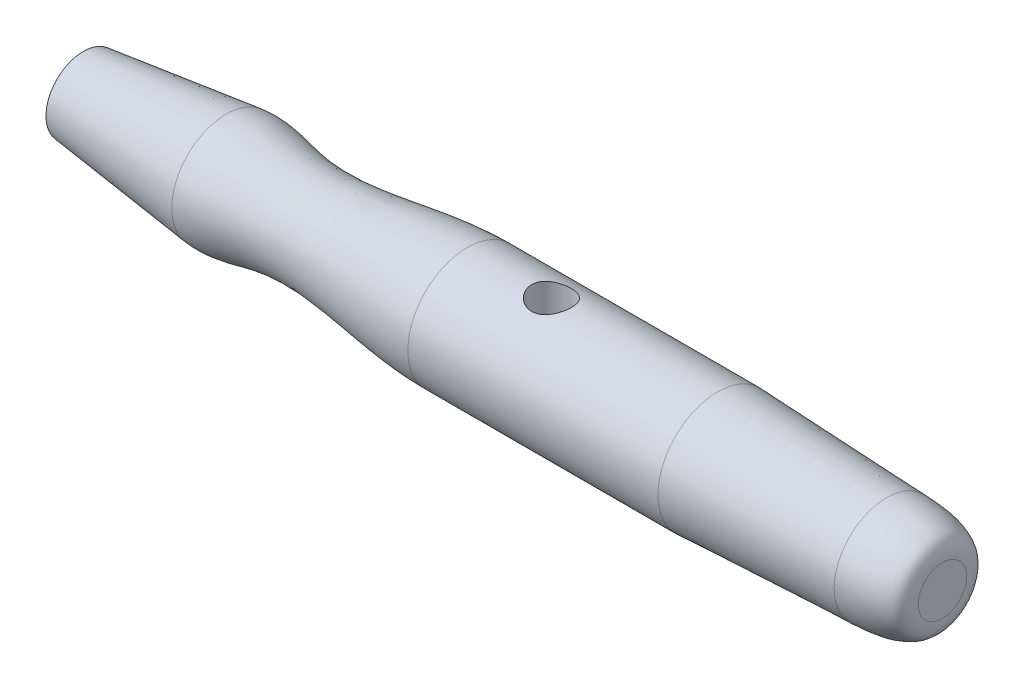
ISO-10303-21;
HEADER;
FILE_DESCRIPTION(('STEP AP214'),'2;1');
FILE_NAME('part.step','',(''),(''),'','','');
FILE_SCHEMA(('AUTOMOTIVE_DESIGN { 1 0 10303 214 1 1 1 1 }'));
ENDSEC;
DATA;
#1=APPLICATION_CONTEXT('core data for automotive mechanical design processes');
#2=APPLICATION_PROTOCOL_DEFINITION('international standard','automotive_design',2000,#1);
#3=PRODUCT_CONTEXT('',#1,'mechanical');
#4=PRODUCT('Part','Part','',(#3));
#5=PRODUCT_RELATED_PRODUCT_CATEGORY('part','',(#4));
#6=PRODUCT_DEFINITION_FORMATION('','',#4);
#7=PRODUCT_DEFINITION_CONTEXT('part definition',#1,'design');
#8=PRODUCT_DEFINITION('design','',#6,#7);
#9=PRODUCT_DEFINITION_SHAPE('','',#8);
#10=(LENGTH_UNIT() NAMED_UNIT(*) SI_UNIT(.MILLI.,.METRE.));
#11=(NAMED_UNIT(*) PLANE_ANGLE_UNIT() SI_UNIT($,.RADIAN.));
#12=(NAMED_UNIT(*) SI_UNIT($,.STERADIAN.) SOLID_ANGLE_UNIT());
#13=UNCERTAINTY_MEASURE_WITH_UNIT(LENGTH_MEASURE(1.E-05),#10,'distance_accuracy_value','');
#14=(GEOMETRIC_REPRESENTATION_CONTEXT(3) GLOBAL_UNCERTAINTY_ASSIGNED_CONTEXT((#13)) GLOBAL_UNIT_ASSIGNED_CONTEXT((#10,
#11,#12)) REPRESENTATION_CONTEXT('',''));
#15=CARTESIAN_POINT('',(0.,0.,0.));
#16=DIRECTION('',(0.,0.,1.));
#17=DIRECTION('',(1.,0.,0.));
#18=AXIS2_PLACEMENT_3D('',#15,#16,#17);
#19=CARTESIAN_POINT('',(-137.5,0.,0.));
#20=DIRECTION('',(-1.,0.,0.));
#21=DIRECTION('',(0.,-1.,0.));
#22=AXIS2_PLACEMENT_3D('',#19,#20,#21);
#23=CYLINDRICAL_SURFACE('',#22,19.05);
#24=CARTESIAN_POINT('',(-14.564,0.,0.));
#25=DIRECTION('',(-1.,0.,0.));
#26=DIRECTION('',(0.,-1.,0.));
#27=AXIS2_PLACEMENT_3D('',#24,#25,#26);
#28=CIRCLE('',#27,19.05);
#29=CARTESIAN_POINT('',(-14.564,-19.0499999999999,0.));
#30=VERTEX_POINT('',#29);
#31=EDGE_CURVE('E66',#30,#30,#28,.T.);
#32=ORIENTED_EDGE('',*,*,#31,.F.);
#33=EDGE_LOOP('',(#32));
#34=FACE_BOUND('',#33,.T.);
#35=CARTESIAN_POINT('',(65.5,0.,0.));
#36=DIRECTION('',(-1.,0.,0.));
#37=DIRECTION('',(0.,-1.,0.));
#38=AXIS2_PLACEMENT_3D('',#35,#36,#37);
#39=CIRCLE('',#38,19.05);
#40=CARTESIAN_POINT('',(65.5,-19.0499999999999,0.));
#41=VERTEX_POINT('',#40);
#42=EDGE_CURVE('E60',#41,#41,#39,.T.);
#43=ORIENTED_EDGE('',*,*,#42,.T.);
#44=EDGE_LOOP('',(#43));
#45=FACE_BOUND('',#44,.T.);
#46=CARTESIAN_POINT('',(12.36,17.9605122421383,-6.35));
#47=CARTESIAN_POINT('',(12.5329048893612,17.9605121841743,-6.35000007467187));
#48=CARTESIAN_POINT('',(12.7058086993195,17.9630158170993,-6.34293207443151));
#49=CARTESIAN_POINT('',(13.0503843538287,17.9729507908354,-6.31472584323583));
#50=CARTESIAN_POINT('',(13.2220557255694,17.9803839303172,-6.29358247647192));
#51=CARTESIAN_POINT('',(13.5627977784464,17.9999387474085,-6.23743424237858));
#52=CARTESIAN_POINT('',(13.7318690890143,18.0120592710937,-6.20243278653587));
#53=CARTESIAN_POINT('',(14.0663229836838,18.0406142280405,-6.11887938259321));
#54=CARTESIAN_POINT('',(14.2317040989144,18.0570503470113,-6.07032213901403));
#55=CARTESIAN_POINT('',(14.5572047901502,18.0936898864177,-5.9602215150775));
#56=CARTESIAN_POINT('',(14.7173359800168,18.1138842233465,-5.89870940004715));
#57=CARTESIAN_POINT('',(15.0317916435437,18.1574836120493,-5.76310329571688));
#58=CARTESIAN_POINT('',(15.186113936605,18.1808898545199,-5.68900463798159));
#59=CARTESIAN_POINT('',(15.4879320456376,18.2302439315275,-5.52880871589195));
#60=CARTESIAN_POINT('',(15.6354291340736,18.2561912894746,-5.44271370019568));
#61=CARTESIAN_POINT('',(15.9228285658147,18.3099374140938,-5.25907267568229));
#62=CARTESIAN_POINT('',(16.0627281535657,18.3377368444647,-5.16152255221946));
#63=CARTESIAN_POINT('',(16.3388924543855,18.3954535011269,-4.9519704663745));
#64=CARTESIAN_POINT('',(16.4748537151547,18.4254108542597,-4.83957945535955));
#65=CARTESIAN_POINT('',(16.7369169809071,18.4857008813243,-4.60392786160509));
#66=CARTESIAN_POINT('',(16.86301879383,18.5160335625541,-4.48066706722364));
#67=CARTESIAN_POINT('',(17.1046289023187,18.5762700584007,-4.22398755491756));
#68=CARTESIAN_POINT('',(17.2201336501056,18.6061737265825,-4.09056546226525));
#69=CARTESIAN_POINT('',(17.4397204364232,18.6647358311806,-3.81445197871254));
#70=CARTESIAN_POINT('',(17.5438064424056,18.6933946980002,-3.67176383491661));
#71=CARTESIAN_POINT('',(17.742496600939,18.7494517961145,-3.3740336259551));
#72=CARTESIAN_POINT('',(17.8367755240712,18.776796334375,-3.21876410858282));
#73=CARTESIAN_POINT('',(18.0118252185834,18.828598949967,-2.90040622051583));
#74=CARTESIAN_POINT('',(18.0926013189444,18.853058164884,-2.73732096720631));
#75=CARTESIAN_POINT('',(18.2400258776401,18.8984068456182,-2.40436062510117));
#76=CARTESIAN_POINT('',(18.3066714481517,18.9192955815763,-2.23448415681591));
#77=CARTESIAN_POINT('',(18.4251801326333,18.9568787025541,-1.88927888325925));
#78=CARTESIAN_POINT('',(18.4770498876315,18.9735749714878,-1.71395256686032));
#79=CARTESIAN_POINT('',(18.5640178166869,19.0017947733666,-1.36522428846162));
#80=CARTESIAN_POINT('',(18.5996316094182,19.01347650807,-1.19196364650285));
#81=CARTESIAN_POINT('',(18.656290767647,19.0321454456513,-0.842895111101326));
#82=CARTESIAN_POINT('',(18.6773421163871,19.0391345765353,-0.667088294148715));
#83=CARTESIAN_POINT('',(18.7046899160807,19.0482262560928,-0.314209218879316));
#84=CARTESIAN_POINT('',(18.7109867609576,19.0503289352273,-0.137136994473646));
#85=CARTESIAN_POINT('',(18.7087627466738,19.049587568049,0.216901921002763));
#86=CARTESIAN_POINT('',(18.7002422305748,19.0467436362635,0.393868614421933));
#87=CARTESIAN_POINT('',(18.669098834915,19.036399993617,0.739365284519381));
#88=CARTESIAN_POINT('',(18.6470456785782,19.0290884203769,0.907952629393989));
#89=CARTESIAN_POINT('',(18.5895414290879,19.0101669985195,1.24263965626492));
#90=CARTESIAN_POINT('',(18.5540858063356,18.9985556967605,1.40873847746823));
#91=CARTESIAN_POINT('',(18.4701030565091,18.9713411108767,1.73720119624074));
#92=CARTESIAN_POINT('',(18.4215801834594,18.9557391259958,1.89956629068116));
#93=CARTESIAN_POINT('',(18.3118429721928,18.9209335884611,2.21961616319675));
#94=CARTESIAN_POINT('',(18.2506238452836,18.9017286771399,2.37729914957653));
#95=CARTESIAN_POINT('',(18.1151258842597,18.8599382105028,2.68891421853453));
#96=CARTESIAN_POINT('',(18.0406903922671,18.8373126491989,2.8427727771282));
#97=CARTESIAN_POINT('',(17.8798366047179,18.7894305663877,3.14372828729916));
#98=CARTESIAN_POINT('',(17.7934142086573,18.7641731453071,3.29082290202758));
#99=CARTESIAN_POINT('',(17.6092010479193,18.7116626522826,3.57734506918722));
#100=CARTESIAN_POINT('',(17.5114096459081,18.6844094684901,3.71677219114134));
#101=CARTESIAN_POINT('',(17.3050923455741,18.6285822698494,3.98716495399287));
#102=CARTESIAN_POINT('',(17.1965660566329,18.6000082069575,4.11813028669789));
#103=CARTESIAN_POINT('',(16.9640616572674,18.5408779551479,4.37684545048268));
#104=CARTESIAN_POINT('',(16.8395955104998,18.5102919359601,4.50415027127115));
#105=CARTESIAN_POINT('',(16.5804397296168,18.4492888676298,4.74784339620421));
#106=CARTESIAN_POINT('',(16.4457533108898,18.4188717685491,4.86423510815807));
#107=CARTESIAN_POINT('',(16.1668732938627,18.3590231511138,5.08546063018026));
#108=CARTESIAN_POINT('',(16.0226747287521,18.3295921599489,5.19028832447545));
#109=CARTESIAN_POINT('',(15.72577596231,18.2725815338622,5.38756027003843));
#110=CARTESIAN_POINT('',(15.5730791107501,18.2450011787983,5.480009352328));
#111=CARTESIAN_POINT('',(15.2577787513559,18.1921032459389,5.65315834756608));
#112=CARTESIAN_POINT('',(15.0950624597289,18.1668249772563,5.73366516353339));
#113=CARTESIAN_POINT('',(14.7629640367406,18.1198022602484,5.88057969904579));
#114=CARTESIAN_POINT('',(14.5935845355197,18.0980564346221,5.94699291679969));
#115=CARTESIAN_POINT('',(14.2493279189632,18.058801934227,6.06515064268838));
#116=CARTESIAN_POINT('',(14.0744515836549,18.0412926613106,6.1168972217438));
#117=CARTESIAN_POINT('',(13.7205023634224,18.0111045097315,6.20522346520949));
#118=CARTESIAN_POINT('',(13.5414296954307,17.9984253819528,6.24180391182512));
#119=CARTESIAN_POINT('',(13.1886577023196,17.9787949890032,6.29811699796801));
#120=CARTESIAN_POINT('',(13.015080565666,17.971611063163,6.31853543370886));
#121=CARTESIAN_POINT('',(12.6667009613968,17.9622869124369,6.34499394377563));
#122=CARTESIAN_POINT('',(12.4918985372033,17.9601465097146,6.35103452507011));
#123=CARTESIAN_POINT('',(12.1424325037919,17.9609801314463,6.34867652793738));
#124=CARTESIAN_POINT('',(11.9677688768581,17.9639533388488,6.34028025622768));
#125=CARTESIAN_POINT('',(11.6198868596507,17.9749142495206,6.309138563187));
#126=CARTESIAN_POINT('',(11.4466684516347,17.9829018911375,6.28639331827606));
#127=CARTESIAN_POINT('',(11.1089237860065,18.0032708197849,6.22781361622577));
#128=CARTESIAN_POINT('',(10.9443041443268,18.0154905329272,6.19245924965254));
#129=CARTESIAN_POINT('',(10.6186672221139,18.0439996158971,6.10888905897269));
#130=CARTESIAN_POINT('',(10.4576511538251,18.0602903334414,6.06066897527755));
#131=CARTESIAN_POINT('',(10.1403442530326,18.0964645265794,5.95178614996644));
#132=CARTESIAN_POINT('',(9.9840523706642,18.1163471969716,5.89112619656182));
#133=CARTESIAN_POINT('',(9.67704386351722,18.1591611703442,5.75780047904466));
#134=CARTESIAN_POINT('',(9.52632938354142,18.1820936308712,5.68513015384566));
#135=CARTESIAN_POINT('',(9.22677607737642,18.2311431035954,5.52585539435068));
#136=CARTESIAN_POINT('',(9.07814421393858,18.257337418412,5.4388855184361));
#137=CARTESIAN_POINT('',(8.78861963569909,18.3115953760894,5.25331510969612));
#138=CARTESIAN_POINT('',(8.64772961588815,18.3396596624723,5.15471056388415));
#139=CARTESIAN_POINT('',(8.37453406252708,18.3969044730028,4.9465198326357));
#140=CARTESIAN_POINT('',(8.24222930474783,18.4260850976459,4.83693265707056));
#141=CARTESIAN_POINT('',(7.98697045700054,18.4848033864811,4.60744722274103));
#142=CARTESIAN_POINT('',(7.86401658404977,18.5143410589412,4.48754872480687));
#143=CARTESIAN_POINT('',(7.62246831380917,18.5744412121883,4.23209963560971));
#144=CARTESIAN_POINT('',(7.50437239621551,18.6049841614765,4.09607248840989));
#145=CARTESIAN_POINT('',(7.28007578377248,18.664778246815,3.81435164909172));
#146=CARTESIAN_POINT('',(7.17387112411002,18.6940298114599,3.66866120488881));
#147=CARTESIAN_POINT('',(6.97402901818268,18.7504530318865,3.3684336930749));
#148=CARTESIAN_POINT('',(6.88039635203512,18.7776238948672,3.21389329221657));
#149=CARTESIAN_POINT('',(6.70650426640412,18.8291029215125,2.89708847566713));
#150=CARTESIAN_POINT('',(6.62623923996242,18.8534122841516,2.73482733528804));
#151=CARTESIAN_POINT('',(6.48015853214839,18.8983526620096,2.40465168177921));
#152=CARTESIAN_POINT('',(6.41425641078046,18.9190055333313,2.23677842238123));
#153=CARTESIAN_POINT('',(6.29688441019861,18.9562198624823,1.89569072154763));
#154=CARTESIAN_POINT('',(6.24540867351838,18.9727829805258,1.72247847967073));
#155=CARTESIAN_POINT('',(6.15734792817547,19.0013461729396,1.37195443604879));
#156=CARTESIAN_POINT('',(6.12076150306406,19.0133466813523,1.19464302596226));
#157=CARTESIAN_POINT('',(6.06284105210709,19.0324318084485,0.837286870863789));
#158=CARTESIAN_POINT('',(6.04150636962456,19.0395166387673,0.657242243866559));
#159=CARTESIAN_POINT('',(6.0149507937708,19.0483464738216,0.304399939069057));
#160=CARTESIAN_POINT('',(6.00901662773618,19.050327811339,0.131661476409807));
#161=CARTESIAN_POINT('',(6.01124883539023,19.049583701765,-0.21377539227599));
#162=CARTESIAN_POINT('',(6.01942001187633,19.0468566514914,-0.386473764626123));
#163=CARTESIAN_POINT('',(6.04978713971672,19.036769222305,-0.730414910159583));
#164=CARTESIAN_POINT('',(6.07197673003419,19.0294109448771,-0.90165830785822));
#165=CARTESIAN_POINT('',(6.1301769110018,19.010258841641,-1.24159215291774));
#166=CARTESIAN_POINT('',(6.16619266298495,18.9984633594488,-1.41028162241909));
#167=CARTESIAN_POINT('',(6.25101904977245,18.9709796061496,-1.74113205541997));
#168=CARTESIAN_POINT('',(6.29961147550841,18.9553579469971,-1.90335462060486));
#169=CARTESIAN_POINT('',(6.40946667760174,18.920521496432,-2.22311558916087));
#170=CARTESIAN_POINT('',(6.47073396730047,18.9013054253338,-2.38065230104733));
#171=CARTESIAN_POINT('',(6.60543358155544,18.8597702235758,-2.68996559538903));
#172=CARTESIAN_POINT('',(6.67886325404243,18.8374517695764,-2.84174342474925));
#173=CARTESIAN_POINT('',(6.8373888061244,18.7902503646299,-3.13872746855851));
#174=CARTESIAN_POINT('',(6.9224888671748,18.7653664953012,-3.28393130265417));
#175=CARTESIAN_POINT('',(7.10709571414095,18.7126933760356,-3.57209205622814));
#176=CARTESIAN_POINT('',(7.20701719248428,18.6848309370529,-3.71477001212558));
#177=CARTESIAN_POINT('',(7.41808742629958,18.6277261015556,-3.99127224330518));
#178=CARTESIAN_POINT('',(7.52923657499846,18.5984836567283,-4.12509620822201));
#179=CARTESIAN_POINT('',(7.76210974791763,18.5393610594388,-4.38316388676336));
#180=CARTESIAN_POINT('',(7.88383853090085,18.5094806246121,-4.50740324126623));
#181=CARTESIAN_POINT('',(8.13705111119739,18.4498824788936,-4.74546004441081));
#182=CARTESIAN_POINT('',(8.26853175258196,18.4201647186707,-4.85928083833075));
#183=CARTESIAN_POINT('',(8.5459046797865,18.3605083051536,-5.0801412712014));
#184=CARTESIAN_POINT('',(8.69216146794026,18.3306074981088,-5.18673395080548));
#185=CARTESIAN_POINT('',(8.9934458815642,18.2727076517125,-5.38716410257997));
#186=CARTESIAN_POINT('',(9.14847020652462,18.2447079053334,-5.4810063299439));
#187=CARTESIAN_POINT('',(9.4663733732635,18.191440834821,-5.65528861435427));
#188=CARTESIAN_POINT('',(9.62925378111994,18.1661740587765,-5.73572598484048));
#189=CARTESIAN_POINT('',(9.96167102085719,18.119186796233,-5.88247472021432));
#190=CARTESIAN_POINT('',(10.1312048076611,18.09746471037,-5.9487924600178));
#191=CARTESIAN_POINT('',(10.4680578405731,18.0591448851981,-6.06410020462713));
#192=CARTESIAN_POINT('',(10.635135783141,18.042361110104,-6.11373361228482));
#193=CARTESIAN_POINT('',(10.973106231664,18.0131937705727,-6.19914429051323));
#194=CARTESIAN_POINT('',(11.1439971338891,18.0008083919142,-6.2349272745633));
#195=CARTESIAN_POINT('',(11.4884038572939,17.9808267796658,-6.29232024349929));
#196=CARTESIAN_POINT('',(11.6619194062581,17.9732300528606,-6.3139316880161));
#197=CARTESIAN_POINT('',(12.01029034166,17.9630728234143,-6.34277149992564));
#198=CARTESIAN_POINT('',(12.1851457227696,17.9605123007558,-6.34999992448626));
#199=CARTESIAN_POINT('',(12.36,17.9605122421383,-6.35));
#200=B_SPLINE_CURVE_WITH_KNOTS('',3,(#46,#47,#48,#49,#50,#51,#52,#53,#54,#55,#56,#57,#58,#59,
#60,#61,#62,#63,#64,#65,#66,#67,#68,#69,#70,#71,#72,#73,#74,#75,#76,#77,#78,#79,#80,#81,#82,#83,
#84,#85,#86,#87,#88,#89,#90,#91,#92,#93,#94,#95,#96,#97,#98,#99,#100,#101,#102,#103,#104,#105,
#106,#107,#108,#109,#110,#111,#112,#113,#114,#115,#116,#117,#118,#119,#120,#121,#122,#123,#124,
#125,#126,#127,#128,#129,#130,#131,#132,#133,#134,#135,#136,#137,#138,#139,#140,#141,#142,#143,
#144,#145,#146,#147,#148,#149,#150,#151,#152,#153,#154,#155,#156,#157,#158,#159,#160,#161,#162,
#163,#164,#165,#166,#167,#168,#169,#170,#171,#172,#173,#174,#175,#176,#177,#178,#179,#180,#181,
#182,#183,#184,#185,#186,#187,#188,#189,#190,#191,#192,#193,#194,#195,#196,#197,#198,#199),
.UNSPECIFIED.,.T.,.F.,(4,2,2,2,2,2,2,2,2,2,2,2,2,2,2,2,2,2,2,2,2,2,2,2,2,2,2,2,2,2,2,2,2,2,2,2,
2,2,2,2,2,2,2,2,2,2,2,2,2,2,2,2,2,2,2,2,2,2,2,2,2,2,2,2,2,2,2,2,2,2,2,2,2,2,2,2,4),(0.,
0.518551190720206,1.03729169377054,1.55590457625912,2.07472033562746,2.592298044827,
3.11006814803522,3.62774132802884,4.14560102700588,4.68177234198808,5.21795409889,
5.75431471335886,6.2904883746662,6.84090158058548,7.39109704669767,7.94140484680646,
8.49146491800034,9.02260055284767,9.5535178312266,10.084420934737,10.6153117465768,
11.1252544428486,11.635369637518,12.145318965252,12.6554609833795,13.1721116844525,
13.6889395603306,14.2057964229859,14.7226720998249,15.2639930028963,15.805144302114,
16.3465804375137,16.8878046459563,17.4370000687288,17.9859808433419,18.5348840635372,
19.0837589700889,19.6078648257983,20.1319522010648,20.6559558455359,21.1799530475291,
21.6858208709719,22.1918563856786,22.6977786037881,23.2038933954328,23.7258764687289,
24.2480401116692,24.7702508722021,25.2924737486133,25.8399546814312,26.387252524741,
26.934757875636,27.482032997888,28.0259174775812,28.5695808058328,29.113192402254,
29.6567805930241,30.1747024737475,30.6928007390254,31.2106640791972,31.728720927042,
32.2383303533507,32.7481215577426,33.2578017455692,33.7676650293052,34.2962769393839,
34.8249073694708,35.3537768226458,35.8824758619217,36.4321092541269,36.9815370983736,
37.5310749251787,38.0803641108162,38.605034396734,39.1294880181041,39.6538876136575,
40.1782851248866),.UNSPECIFIED.);
#201=CARTESIAN_POINT('',(12.36,17.9605122421383,-6.35));
#202=VERTEX_POINT('',#201);
#203=EDGE_CURVE('E126',#202,#202,#200,.T.);
#204=ORIENTED_EDGE('',*,*,#203,.T.);
#205=EDGE_LOOP('',(#204));
#206=FACE_BOUND('',#205,.T.);
#207=ADVANCED_FACE('F42',(#34,#45,#206),#23,.T.);
#208=CARTESIAN_POINT('',(-91.78,0.,0.));
#209=DIRECTION('',(1.,0.,0.));
#210=DIRECTION('',(0.,1.,0.));
#211=AXIS2_PLACEMENT_3D('',#208,#209,#210);
#212=CONICAL_SURFACE('',#211,17.399,0.11888122095754);
#213=CARTESIAN_POINT('',(-137.5,0.,0.));
#214=DIRECTION('',(-1.,0.,0.));
#215=DIRECTION('',(0.,-1.,0.));
#216=AXIS2_PLACEMENT_3D('',#213,#214,#215);
#217=CIRCLE('',#216,11.938);
#218=CARTESIAN_POINT('',(-137.5,-11.938,0.));
#219=VERTEX_POINT('',#218);
#220=EDGE_CURVE('E10',#219,#219,#217,.T.);
#221=ORIENTED_EDGE('',*,*,#220,.F.);
#222=EDGE_LOOP('',(#221));
#223=FACE_BOUND('',#222,.T.);
#224=CARTESIAN_POINT('',(-91.78,0.,0.));
#225=DIRECTION('',(-1.,0.,0.));
#226=DIRECTION('',(0.,-1.,0.));
#227=AXIS2_PLACEMENT_3D('',#224,#225,#226);
#228=CIRCLE('',#227,17.399);
#229=CARTESIAN_POINT('',(-91.78,-17.399,0.));
#230=VERTEX_POINT('',#229);
#231=EDGE_CURVE('E70',#230,#230,#228,.T.);
#232=ORIENTED_EDGE('',*,*,#231,.T.);
#233=EDGE_LOOP('',(#232));
#234=FACE_BOUND('',#233,.T.);
#235=ADVANCED_FACE('F44',(#223,#234),#212,.T.);
#236=CARTESIAN_POINT('',(-137.5,11.938,0.));
#237=DIRECTION('',(1.,0.,0.));
#238=DIRECTION('',(0.,1.,0.));
#239=AXIS2_PLACEMENT_3D('',#236,#237,#238);
#240=PLANE('',#239);
#241=ORIENTED_EDGE('',*,*,#220,.T.);
#242=EDGE_LOOP('',(#241));
#243=FACE_BOUND('',#242,.T.);
#244=ADVANCED_FACE('F108',(#243),#240,.F.);
#245=CARTESIAN_POINT('',(137.5,7.74700000000005,0.));
#246=DIRECTION('',(-1.,0.,0.));
#247=DIRECTION('',(0.,-1.,0.));
#248=AXIS2_PLACEMENT_3D('',#245,#246,#247);
#249=PLANE('',#248);
#250=CARTESIAN_POINT('',(137.5,0.,0.));
#251=DIRECTION('',(-1.,0.,0.));
#252=DIRECTION('',(0.,-1.,0.));
#253=AXIS2_PLACEMENT_3D('',#250,#251,#252);
#254=CIRCLE('',#253,7.747);
#255=CARTESIAN_POINT('',(137.5,-7.74699999999995,0.));
#256=VERTEX_POINT('',#255);
#257=EDGE_CURVE('E50',#256,#256,#254,.T.);
#258=ORIENTED_EDGE('',*,*,#257,.F.);
#259=EDGE_LOOP('',(#258));
#260=FACE_BOUND('',#259,.T.);
#261=ADVANCED_FACE('F105',(#260),#249,.F.);
#262=CARTESIAN_POINT('',(137.5,7.74700000000005,0.));
#263=CARTESIAN_POINT('',(137.5,12.322795174278,0.));
#264=CARTESIAN_POINT('',(132.251729161469,15.7307599018356,0.));
#265=CARTESIAN_POINT('',(126.446685513367,16.4747879360549,0.));
#266=CARTESIAN_POINT('',(119.602,16.764,0.));
#267=B_SPLINE_CURVE_WITH_KNOTS('',3,(#262,#263,#264,#265,#266),.UNSPECIFIED.,.F.,.F.,(4,1,4),
(0.,0.343752138132964,1.),.UNSPECIFIED.);
#268=CARTESIAN_POINT('',(-137.5,0.,0.));
#269=DIRECTION('',(-1.,0.,0.));
#270=AXIS1_PLACEMENT('',#268,#269);
#271=SURFACE_OF_REVOLUTION('',#267,#270);
#272=CARTESIAN_POINT('',(119.602,0.,0.));
#273=DIRECTION('',(-1.,0.,0.));
#274=DIRECTION('',(0.,-1.,0.));
#275=AXIS2_PLACEMENT_3D('',#272,#273,#274);
#276=CIRCLE('',#275,16.764);
#277=CARTESIAN_POINT('',(119.602,-16.7639999999999,0.));
#278=VERTEX_POINT('',#277);
#279=EDGE_CURVE('E55',#278,#278,#276,.T.);
#280=ORIENTED_EDGE('',*,*,#279,.F.);
#281=EDGE_LOOP('',(#280));
#282=FACE_BOUND('',#281,.T.);
#283=ORIENTED_EDGE('',*,*,#257,.T.);
#284=EDGE_LOOP('',(#283));
#285=FACE_BOUND('',#284,.T.);
#286=ADVANCED_FACE('F101',(#282,#285),#271,.T.);
#287=CARTESIAN_POINT('',(119.602,0.,0.));
#288=DIRECTION('',(-1.,0.,0.));
#289=DIRECTION('',(0.,-1.,0.));
#290=AXIS2_PLACEMENT_3D('',#287,#288,#289);
#291=CONICAL_SURFACE('',#290,16.764,0.042228402113002);
#292=ORIENTED_EDGE('',*,*,#42,.F.);
#293=EDGE_LOOP('',(#292));
#294=FACE_BOUND('',#293,.T.);
#295=ORIENTED_EDGE('',*,*,#279,.T.);
#296=EDGE_LOOP('',(#295));
#297=FACE_BOUND('',#296,.T.);
#298=ADVANCED_FACE('F92',(#294,#297),#291,.T.);
#299=CARTESIAN_POINT('',(-14.564,19.05,0.));
#300=CARTESIAN_POINT('',(-35.8294470897163,19.05,0.));
#301=CARTESIAN_POINT('',(-60.549292723355,10.0128053188379,0.));
#302=CARTESIAN_POINT('',(-84.9013365409294,18.220618135389,0.));
#303=CARTESIAN_POINT('',(-91.78,17.399,0.));
#304=B_SPLINE_CURVE_WITH_KNOTS('',3,(#299,#300,#301,#302,#303),.UNSPECIFIED.,.F.,.F.,(4,1,4),
(0.,0.755761848674318,1.),.UNSPECIFIED.);
#305=CARTESIAN_POINT('',(-137.5,0.,0.));
#306=DIRECTION('',(-1.,0.,0.));
#307=AXIS1_PLACEMENT('',#305,#306);
#308=SURFACE_OF_REVOLUTION('',#304,#307);
#309=ORIENTED_EDGE('',*,*,#231,.F.);
#310=EDGE_LOOP('',(#309));
#311=FACE_BOUND('',#310,.T.);
#312=ORIENTED_EDGE('',*,*,#31,.T.);
#313=EDGE_LOOP('',(#312));
#314=FACE_BOUND('',#313,.T.);
#315=ADVANCED_FACE('F87',(#311,#314),#308,.T.);
#316=CARTESIAN_POINT('',(12.36,19.051,0.));
#317=DIRECTION('',(0.,-1.,0.));
#318=DIRECTION('',(0.,0.,-1.));
#319=AXIS2_PLACEMENT_3D('',#316,#317,#318);
#320=CYLINDRICAL_SURFACE('',#319,6.35);
#321=CARTESIAN_POINT('',(12.36,0.,0.));
#322=DIRECTION('',(0.,1.,0.));
#323=DIRECTION('',(0.,0.,1.));
#324=AXIS2_PLACEMENT_3D('',#321,#322,#323);
#325=CIRCLE('',#324,6.35);
#326=CARTESIAN_POINT('',(12.36,0.,6.35));
#327=VERTEX_POINT('',#326);
#328=EDGE_CURVE('E74',#327,#327,#325,.T.);
#329=ORIENTED_EDGE('',*,*,#328,.F.);
#330=EDGE_LOOP('',(#329));
#331=FACE_BOUND('',#330,.T.);
#332=ORIENTED_EDGE('',*,*,#203,.F.);
#333=EDGE_LOOP('',(#332));
#334=FACE_BOUND('',#333,.T.);
#335=ADVANCED_FACE('F91',(#331,#334),#320,.F.);
#336=CARTESIAN_POINT('',(12.36,0.,0.));
#337=DIRECTION('',(0.,1.,0.));
#338=DIRECTION('',(0.,0.,1.));
#339=AXIS2_PLACEMENT_3D('',#336,#337,#338);
#340=PLANE('',#339);
#341=ORIENTED_EDGE('',*,*,#328,.T.);
#342=EDGE_LOOP('',(#341));
#343=FACE_BOUND('',#342,.T.);
#344=ADVANCED_FACE('F137',(#343),#340,.T.);
#345=CLOSED_SHELL('',(#207,#235,#244,#261,#286,#298,#315,#335,#344));
#346=MANIFOLD_SOLID_BREP('B2',#345);
#347=ADVANCED_BREP_SHAPE_REPRESENTATION('',(#18,#346),#14);
#348=SHAPE_DEFINITION_REPRESENTATION(#9,#347);
ENDSEC;
END-ISO-10303-21;
